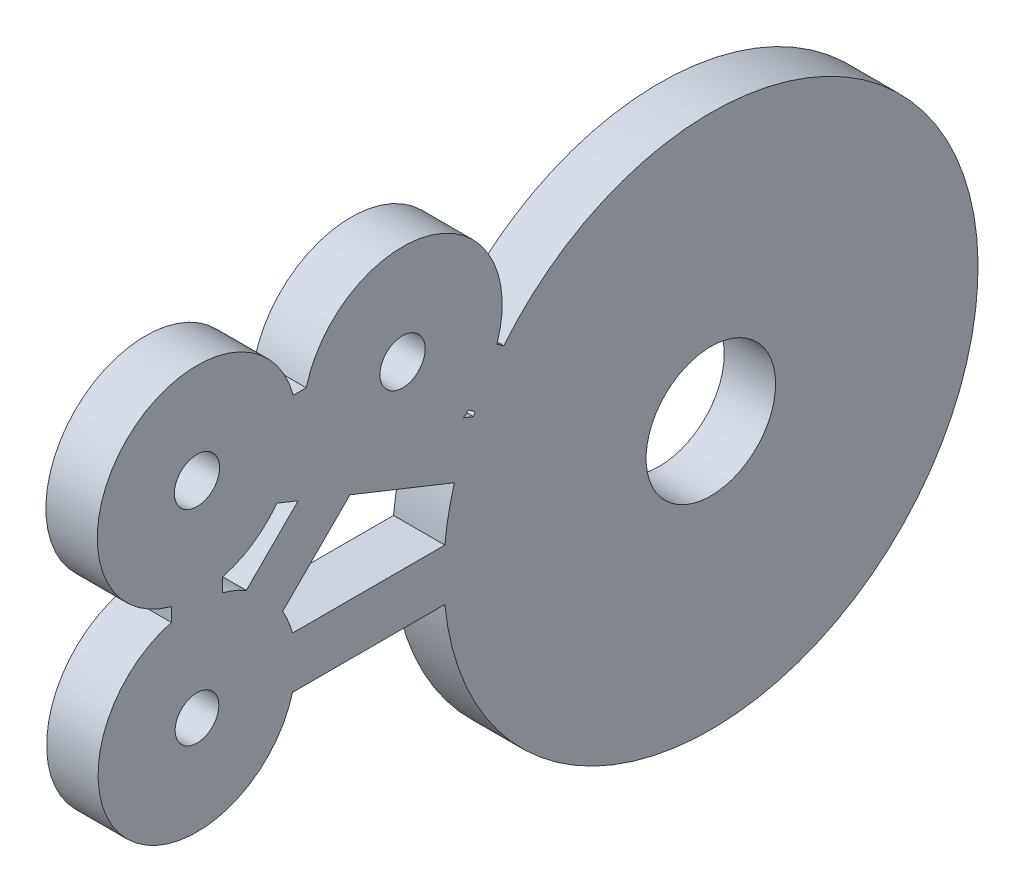
ISO-10303-21;
HEADER;
FILE_DESCRIPTION(('STEP AP214'),'2;1');
FILE_NAME('part.step','',(''),(''),'','','');
FILE_SCHEMA(('AUTOMOTIVE_DESIGN { 1 0 10303 214 1 1 1 1 }'));
ENDSEC;
DATA;
#1=APPLICATION_CONTEXT('core data for automotive mechanical design processes');
#2=APPLICATION_PROTOCOL_DEFINITION('international standard','automotive_design',2000,#1);
#3=PRODUCT_CONTEXT('',#1,'mechanical');
#4=PRODUCT('Part','Part','',(#3));
#5=PRODUCT_RELATED_PRODUCT_CATEGORY('part','',(#4));
#6=PRODUCT_DEFINITION_FORMATION('','',#4);
#7=PRODUCT_DEFINITION_CONTEXT('part definition',#1,'design');
#8=PRODUCT_DEFINITION('design','',#6,#7);
#9=PRODUCT_DEFINITION_SHAPE('','',#8);
#10=(LENGTH_UNIT() NAMED_UNIT(*) SI_UNIT(.MILLI.,.METRE.));
#11=(NAMED_UNIT(*) PLANE_ANGLE_UNIT() SI_UNIT($,.RADIAN.));
#12=(NAMED_UNIT(*) SI_UNIT($,.STERADIAN.) SOLID_ANGLE_UNIT());
#13=UNCERTAINTY_MEASURE_WITH_UNIT(LENGTH_MEASURE(1.E-05),#10,'distance_accuracy_value','');
#14=(GEOMETRIC_REPRESENTATION_CONTEXT(3) GLOBAL_UNCERTAINTY_ASSIGNED_CONTEXT((#13)) GLOBAL_UNIT_ASSIGNED_CONTEXT((#10,
#11,#12)) REPRESENTATION_CONTEXT('',''));
#15=CARTESIAN_POINT('',(0.,0.,0.));
#16=DIRECTION('',(0.,0.,1.));
#17=DIRECTION('',(1.,0.,0.));
#18=AXIS2_PLACEMENT_3D('',#15,#16,#17);
#19=CARTESIAN_POINT('',(32.6898,28.575,-32.385));
#20=DIRECTION('',(1.,0.,0.));
#21=DIRECTION('',(0.,0.,-1.));
#22=AXIS2_PLACEMENT_3D('',#19,#20,#21);
#23=CYLINDRICAL_SURFACE('',#22,4.9276);
#24=CARTESIAN_POINT('',(35.2298,28.575,-32.385));
#25=DIRECTION('',(1.,0.,0.));
#26=DIRECTION('',(0.,0.,-1.));
#27=AXIS2_PLACEMENT_3D('',#24,#25,#26);
#28=CIRCLE('',#27,4.9276);
#29=CARTESIAN_POINT('',(35.2298,26.9907051256662,-37.0509673714204));
#30=VERTEX_POINT('',#29);
#31=CARTESIAN_POINT('',(35.2298,29.845,-27.6238717975673));
#32=VERTEX_POINT('',#31);
#33=EDGE_CURVE('E317',#30,#32,#28,.T.);
#34=ORIENTED_EDGE('',*,*,#33,.F.);
#35=DIRECTION('',(1.,0.,0.));
#36=VECTOR('',#35,1.);
#37=CARTESIAN_POINT('',(32.6898,26.9907051256662,-37.0509673714204));
#38=LINE('',#37,#36);
#39=CARTESIAN_POINT('',(32.6898,26.9907051256662,-37.0509673714204));
#40=VERTEX_POINT('',#39);
#41=EDGE_CURVE('E11',#40,#30,#38,.T.);
#42=ORIENTED_EDGE('',*,*,#41,.F.);
#43=CARTESIAN_POINT('',(32.6898,28.575,-32.385));
#44=DIRECTION('',(1.,0.,0.));
#45=DIRECTION('',(0.,0.,-1.));
#46=AXIS2_PLACEMENT_3D('',#43,#44,#45);
#47=CIRCLE('',#46,4.9276);
#48=CARTESIAN_POINT('',(32.6898,29.845,-27.6238717975673));
#49=VERTEX_POINT('',#48);
#50=EDGE_CURVE('E326',#40,#49,#47,.T.);
#51=ORIENTED_EDGE('',*,*,#50,.T.);
#52=DIRECTION('',(1.,0.,0.));
#53=VECTOR('',#52,1.);
#54=CARTESIAN_POINT('',(32.6898,29.845,-27.6238717975673));
#55=LINE('',#54,#53);
#56=EDGE_CURVE('E39',#49,#32,#55,.T.);
#57=ORIENTED_EDGE('',*,*,#56,.T.);
#58=EDGE_LOOP('',(#34,#42,#51,#57));
#59=FACE_BOUND('',#58,.T.);
#60=ADVANCED_FACE('F36',(#59),#23,.T.);
#61=CARTESIAN_POINT('',(32.6898,26.7642367038293,-37.3906700041757));
#62=DIRECTION('',(0.,0.832050294337836,-0.554700196225241));
#63=DIRECTION('',(0.,0.554700196225241,0.832050294337836));
#64=AXIS2_PLACEMENT_3D('',#61,#62,#63);
#65=PLANE('',#64);
#66=DIRECTION('',(0.,0.554700196225241,0.832050294337836));
#67=VECTOR('',#66,1.);
#68=CARTESIAN_POINT('',(35.2298,26.7642367038293,-37.3906700041757));
#69=LINE('',#68,#67);
#70=CARTESIAN_POINT('',(35.2298,26.7642367038293,-37.3906700041757));
#71=VERTEX_POINT('',#70);
#72=EDGE_CURVE('E330',#71,#30,#69,.T.);
#73=ORIENTED_EDGE('',*,*,#72,.F.);
#74=DIRECTION('',(1.,0.,0.));
#75=VECTOR('',#74,1.);
#76=CARTESIAN_POINT('',(32.6898,26.7642367038293,-37.3906700041757));
#77=LINE('',#76,#75);
#78=CARTESIAN_POINT('',(32.6898,26.7642367038293,-37.3906700041757));
#79=VERTEX_POINT('',#78);
#80=EDGE_CURVE('E44',#79,#71,#77,.T.);
#81=ORIENTED_EDGE('',*,*,#80,.F.);
#82=DIRECTION('',(0.,0.554700196225241,0.832050294337836));
#83=VECTOR('',#82,1.);
#84=CARTESIAN_POINT('',(32.6898,26.7642367038293,-37.3906700041757));
#85=LINE('',#84,#83);
#86=EDGE_CURVE('E348',#79,#40,#85,.T.);
#87=ORIENTED_EDGE('',*,*,#86,.T.);
#88=ORIENTED_EDGE('',*,*,#41,.T.);
#89=EDGE_LOOP('',(#73,#81,#87,#88));
#90=FACE_BOUND('',#89,.T.);
#91=ADVANCED_FACE('F395',(#90),#65,.T.);
#92=CARTESIAN_POINT('',(32.6898,18.415,-47.625));
#93=DIRECTION('',(1.,0.,0.));
#94=DIRECTION('',(0.,0.,-1.));
#95=AXIS2_PLACEMENT_3D('',#92,#93,#94);
#96=CYLINDRICAL_SURFACE('',#95,13.208);
#97=CARTESIAN_POINT('',(35.2298,18.415,-47.625));
#98=DIRECTION('',(1.,0.,0.));
#99=DIRECTION('',(0.,0.,-1.));
#100=AXIS2_PLACEMENT_3D('',#97,#98,#99);
#101=CIRCLE('',#100,13.208);
#102=CARTESIAN_POINT('',(35.2298,17.145,-34.4781994766787));
#103=VERTEX_POINT('',#102);
#104=EDGE_CURVE('E368',#103,#71,#101,.T.);
#105=ORIENTED_EDGE('',*,*,#104,.F.);
#106=DIRECTION('',(1.,0.,0.));
#107=VECTOR('',#106,1.);
#108=CARTESIAN_POINT('',(32.6898,17.145,-34.4781994766787));
#109=LINE('',#108,#107);
#110=CARTESIAN_POINT('',(32.6898,17.145,-34.4781994766787));
#111=VERTEX_POINT('',#110);
#112=EDGE_CURVE('E374',#111,#103,#109,.T.);
#113=ORIENTED_EDGE('',*,*,#112,.F.);
#114=CARTESIAN_POINT('',(32.6898,18.415,-47.625));
#115=DIRECTION('',(1.,0.,0.));
#116=DIRECTION('',(0.,0.,-1.));
#117=AXIS2_PLACEMENT_3D('',#114,#115,#116);
#118=CIRCLE('',#117,13.208);
#119=EDGE_CURVE('E345',#111,#79,#118,.T.);
#120=ORIENTED_EDGE('',*,*,#119,.T.);
#121=ORIENTED_EDGE('',*,*,#80,.T.);
#122=EDGE_LOOP('',(#105,#113,#120,#121));
#123=FACE_BOUND('',#122,.T.);
#124=ADVANCED_FACE('F415',(#123),#96,.T.);
#125=CARTESIAN_POINT('',(32.6898,17.145,-26.9466851070354));
#126=DIRECTION('',(0.,-1.,0.));
#127=DIRECTION('',(0.,0.,-1.));
#128=AXIS2_PLACEMENT_3D('',#125,#126,#127);
#129=PLANE('',#128);
#130=DIRECTION('',(0.,0.,-1.));
#131=VECTOR('',#130,1.);
#132=CARTESIAN_POINT('',(35.2298,17.145,-26.9466851070354));
#133=LINE('',#132,#131);
#134=CARTESIAN_POINT('',(35.2298,17.145,-26.9466851070354));
#135=VERTEX_POINT('',#134);
#136=EDGE_CURVE('E365',#135,#103,#133,.T.);
#137=ORIENTED_EDGE('',*,*,#136,.F.);
#138=DIRECTION('',(1.,0.,0.));
#139=VECTOR('',#138,1.);
#140=CARTESIAN_POINT('',(32.6898,17.145,-26.9466851070354));
#141=LINE('',#140,#139);
#142=CARTESIAN_POINT('',(32.6898,17.145,-26.9466851070354));
#143=VERTEX_POINT('',#142);
#144=EDGE_CURVE('E376',#143,#135,#141,.T.);
#145=ORIENTED_EDGE('',*,*,#144,.F.);
#146=DIRECTION('',(0.,0.,-1.));
#147=VECTOR('',#146,1.);
#148=CARTESIAN_POINT('',(32.6898,17.145,-26.9466851070354));
#149=LINE('',#148,#147);
#150=EDGE_CURVE('E342',#143,#111,#149,.T.);
#151=ORIENTED_EDGE('',*,*,#150,.T.);
#152=ORIENTED_EDGE('',*,*,#112,.T.);
#153=EDGE_LOOP('',(#137,#145,#151,#152));
#154=FACE_BOUND('',#153,.T.);
#155=ADVANCED_FACE('F413',(#154),#129,.T.);
#156=CARTESIAN_POINT('',(32.6898,18.415,-22.225));
#157=DIRECTION('',(1.,0.,0.));
#158=DIRECTION('',(0.,0.,-1.));
#159=AXIS2_PLACEMENT_3D('',#156,#157,#158);
#160=CYLINDRICAL_SURFACE('',#159,4.8895);
#161=CARTESIAN_POINT('',(35.2298,18.415,-22.225));
#162=DIRECTION('',(1.,0.,0.));
#163=DIRECTION('',(0.,0.,-1.));
#164=AXIS2_PLACEMENT_3D('',#161,#162,#163);
#165=CIRCLE('',#164,4.8895);
#166=CARTESIAN_POINT('',(35.2298,23.1366851070354,-20.955));
#167=VERTEX_POINT('',#166);
#168=EDGE_CURVE('E362',#167,#135,#165,.T.);
#169=ORIENTED_EDGE('',*,*,#168,.F.);
#170=DIRECTION('',(1.,0.,0.));
#171=VECTOR('',#170,1.);
#172=CARTESIAN_POINT('',(32.6898,23.1366851070354,-20.955));
#173=LINE('',#172,#171);
#174=CARTESIAN_POINT('',(32.6898,23.1366851070354,-20.955));
#175=VERTEX_POINT('',#174);
#176=EDGE_CURVE('E378',#175,#167,#173,.T.);
#177=ORIENTED_EDGE('',*,*,#176,.F.);
#178=CARTESIAN_POINT('',(32.6898,18.415,-22.225));
#179=DIRECTION('',(1.,0.,0.));
#180=DIRECTION('',(0.,0.,-1.));
#181=AXIS2_PLACEMENT_3D('',#178,#179,#180);
#182=CIRCLE('',#181,4.8895);
#183=EDGE_CURVE('E339',#175,#143,#182,.T.);
#184=ORIENTED_EDGE('',*,*,#183,.T.);
#185=ORIENTED_EDGE('',*,*,#144,.T.);
#186=EDGE_LOOP('',(#169,#177,#184,#185));
#187=FACE_BOUND('',#186,.T.);
#188=ADVANCED_FACE('F409',(#187),#160,.T.);
#189=CARTESIAN_POINT('',(32.6898,23.8138717975673,-20.955));
#190=DIRECTION('',(0.,0.,1.));
#191=DIRECTION('',(0.,-1.,0.));
#192=AXIS2_PLACEMENT_3D('',#189,#190,#191);
#193=PLANE('',#192);
#194=DIRECTION('',(0.,-1.,0.));
#195=VECTOR('',#194,1.);
#196=CARTESIAN_POINT('',(35.2298,23.8138717975673,-20.955));
#197=LINE('',#196,#195);
#198=CARTESIAN_POINT('',(35.2298,23.8138717975673,-20.955));
#199=VERTEX_POINT('',#198);
#200=EDGE_CURVE('E359',#199,#167,#197,.T.);
#201=ORIENTED_EDGE('',*,*,#200,.F.);
#202=DIRECTION('',(1.,0.,0.));
#203=VECTOR('',#202,1.);
#204=CARTESIAN_POINT('',(32.6898,23.8138717975673,-20.955));
#205=LINE('',#204,#203);
#206=CARTESIAN_POINT('',(32.6898,23.8138717975673,-20.955));
#207=VERTEX_POINT('',#206);
#208=EDGE_CURVE('E380',#207,#199,#205,.T.);
#209=ORIENTED_EDGE('',*,*,#208,.F.);
#210=DIRECTION('',(0.,-1.,0.));
#211=VECTOR('',#210,1.);
#212=CARTESIAN_POINT('',(32.6898,23.8138717975673,-20.955));
#213=LINE('',#212,#211);
#214=EDGE_CURVE('E336',#207,#175,#213,.T.);
#215=ORIENTED_EDGE('',*,*,#214,.T.);
#216=ORIENTED_EDGE('',*,*,#176,.T.);
#217=EDGE_LOOP('',(#201,#209,#215,#216));
#218=FACE_BOUND('',#217,.T.);
#219=ADVANCED_FACE('F407',(#218),#193,.T.);
#220=CARTESIAN_POINT('',(32.6898,28.575,-22.225));
#221=DIRECTION('',(1.,0.,0.));
#222=DIRECTION('',(0.,0.,-1.));
#223=AXIS2_PLACEMENT_3D('',#220,#221,#222);
#224=CYLINDRICAL_SURFACE('',#223,4.9276);
#225=CARTESIAN_POINT('',(35.2298,28.575,-22.225));
#226=DIRECTION('',(1.,0.,0.));
#227=DIRECTION('',(0.,0.,-1.));
#228=AXIS2_PLACEMENT_3D('',#225,#226,#227);
#229=CIRCLE('',#228,4.9276);
#230=CARTESIAN_POINT('',(35.2298,29.845,-26.9861282024327));
#231=VERTEX_POINT('',#230);
#232=EDGE_CURVE('E356',#231,#199,#229,.T.);
#233=ORIENTED_EDGE('',*,*,#232,.F.);
#234=DIRECTION('',(1.,0.,0.));
#235=VECTOR('',#234,1.);
#236=CARTESIAN_POINT('',(32.6898,29.845,-26.9861282024327));
#237=LINE('',#236,#235);
#238=CARTESIAN_POINT('',(32.6898,29.845,-26.9861282024327));
#239=VERTEX_POINT('',#238);
#240=EDGE_CURVE('E381',#239,#231,#237,.T.);
#241=ORIENTED_EDGE('',*,*,#240,.F.);
#242=CARTESIAN_POINT('',(32.6898,28.575,-22.225));
#243=DIRECTION('',(1.,0.,0.));
#244=DIRECTION('',(0.,0.,-1.));
#245=AXIS2_PLACEMENT_3D('',#242,#243,#244);
#246=CIRCLE('',#245,4.9276);
#247=EDGE_CURVE('E333',#239,#207,#246,.T.);
#248=ORIENTED_EDGE('',*,*,#247,.T.);
#249=ORIENTED_EDGE('',*,*,#208,.T.);
#250=EDGE_LOOP('',(#233,#241,#248,#249));
#251=FACE_BOUND('',#250,.T.);
#252=ADVANCED_FACE('F403',(#251),#224,.T.);
#253=CARTESIAN_POINT('',(32.6898,29.845,-27.6238717975673));
#254=DIRECTION('',(0.,1.,0.));
#255=DIRECTION('',(0.,0.,1.));
#256=AXIS2_PLACEMENT_3D('',#253,#254,#255);
#257=PLANE('',#256);
#258=DIRECTION('',(0.,0.,1.));
#259=VECTOR('',#258,1.);
#260=CARTESIAN_POINT('',(35.2298,29.845,-27.6238717975673));
#261=LINE('',#260,#259);
#262=EDGE_CURVE('E353',#32,#231,#261,.T.);
#263=ORIENTED_EDGE('',*,*,#262,.F.);
#264=ORIENTED_EDGE('',*,*,#56,.F.);
#265=DIRECTION('',(0.,0.,1.));
#266=VECTOR('',#265,1.);
#267=CARTESIAN_POINT('',(32.6898,29.845,-27.6238717975673));
#268=LINE('',#267,#266);
#269=EDGE_CURVE('E329',#49,#239,#268,.T.);
#270=ORIENTED_EDGE('',*,*,#269,.T.);
#271=ORIENTED_EDGE('',*,*,#240,.T.);
#272=EDGE_LOOP('',(#263,#264,#270,#271));
#273=FACE_BOUND('',#272,.T.);
#274=ADVANCED_FACE('F389',(#273),#257,.T.);
#275=CARTESIAN_POINT('',(32.6898,28.575,-32.385));
#276=DIRECTION('',(1.,0.,0.));
#277=DIRECTION('',(0.,0.,-1.));
#278=AXIS2_PLACEMENT_3D('',#275,#276,#277);
#279=PLANE('',#278);
#280=DIRECTION('',(0.,-1.,0.));
#281=VECTOR('',#280,1.);
#282=CARTESIAN_POINT('',(32.6898,23.1366851070354,-23.495));
#283=LINE('',#282,#281);
#284=CARTESIAN_POINT('',(32.6898,23.8138717975673,-23.495));
#285=VERTEX_POINT('',#284);
#286=CARTESIAN_POINT('',(32.6898,23.1366851070354,-23.495));
#287=VERTEX_POINT('',#286);
#288=EDGE_CURVE('E193',#285,#287,#283,.T.);
#289=ORIENTED_EDGE('',*,*,#288,.T.);
#290=CARTESIAN_POINT('',(32.6898,18.415,-22.225));
#291=DIRECTION('',(-1.,0.,0.));
#292=DIRECTION('',(0.,0.,-1.));
#293=AXIS2_PLACEMENT_3D('',#290,#291,#292);
#294=CIRCLE('',#293,4.8895);
#295=CARTESIAN_POINT('',(32.6898,22.6517611699192,-24.6657099457054));
#296=VERTEX_POINT('',#295);
#297=EDGE_CURVE('E187',#287,#296,#294,.T.);
#298=ORIENTED_EDGE('',*,*,#297,.T.);
#299=DIRECTION('',(0.,0.707106781186547,-0.707106781186547));
#300=VECTOR('',#299,1.);
#301=CARTESIAN_POINT('',(32.6898,22.6517611699192,-24.6657099457054));
#302=LINE('',#301,#300);
#303=CARTESIAN_POINT('',(32.6898,25.2082775919095,-27.2222263676957));
#304=VERTEX_POINT('',#303);
#305=EDGE_CURVE('E196',#296,#304,#302,.T.);
#306=ORIENTED_EDGE('',*,*,#305,.T.);
#307=DIRECTION('',(0.,0.371390676354106,0.928476690885258));
#308=VECTOR('',#307,1.);
#309=CARTESIAN_POINT('',(32.6898,25.6275959792656,-26.1739303993055));
#310=LINE('',#309,#308);
#311=CARTESIAN_POINT('',(32.6898,25.6275959792656,-26.1739303993055));
#312=VERTEX_POINT('',#311);
#313=EDGE_CURVE('E52',#304,#312,#310,.T.);
#314=ORIENTED_EDGE('',*,*,#313,.T.);
#315=CARTESIAN_POINT('',(32.6898,28.575,-22.225));
#316=DIRECTION('',(-1.,0.,0.));
#317=DIRECTION('',(0.,0.,-1.));
#318=AXIS2_PLACEMENT_3D('',#315,#316,#317);
#319=CIRCLE('',#318,4.9276);
#320=EDGE_CURVE('E211',#312,#285,#319,.T.);
#321=ORIENTED_EDGE('',*,*,#320,.T.);
#322=EDGE_LOOP('',(#289,#298,#306,#314,#321));
#323=FACE_BOUND('',#322,.T.);
#324=CARTESIAN_POINT('',(32.6898,18.415,-47.625));
#325=DIRECTION('',(1.,0.,0.));
#326=DIRECTION('',(0.,0.,-1.));
#327=AXIS2_PLACEMENT_3D('',#324,#325,#326);
#328=CIRCLE('',#327,3.2004);
#329=CARTESIAN_POINT('',(32.6898,18.415,-50.8254));
#330=VERTEX_POINT('',#329);
#331=EDGE_CURVE('E230',#330,#330,#328,.T.);
#332=ORIENTED_EDGE('',*,*,#331,.T.);
#333=EDGE_LOOP('',(#332));
#334=FACE_BOUND('',#333,.T.);
#335=DIRECTION('',(0.,-0.371390676354097,-0.928476690885262));
#336=VECTOR('',#335,1.);
#337=CARTESIAN_POINT('',(32.6898,24.6744017182742,-35.3960753568448));
#338=LINE('',#337,#336);
#339=CARTESIAN_POINT('',(32.6898,24.6744017182742,-35.3960753568448));
#340=VERTEX_POINT('',#339);
#341=CARTESIAN_POINT('',(32.6898,24.476764535673,-35.8901683133478));
#342=VERTEX_POINT('',#341);
#343=EDGE_CURVE('E246',#340,#342,#338,.T.);
#344=ORIENTED_EDGE('',*,*,#343,.T.);
#345=CARTESIAN_POINT('',(32.6898,18.415,-47.625));
#346=DIRECTION('',(-1.,0.,0.));
#347=DIRECTION('',(0.,0.,-1.));
#348=AXIS2_PLACEMENT_3D('',#345,#346,#347);
#349=CIRCLE('',#348,13.208);
#350=CARTESIAN_POINT('',(32.6898,24.6508289562112,-35.9817315057636));
#351=VERTEX_POINT('',#350);
#352=EDGE_CURVE('E236',#342,#351,#349,.T.);
#353=ORIENTED_EDGE('',*,*,#352,.T.);
#354=DIRECTION('',(0.,0.554700196225229,0.832050294337844));
#355=VECTOR('',#354,1.);
#356=CARTESIAN_POINT('',(32.6898,24.877297378048,-35.6420288730083));
#357=LINE('',#356,#355);
#358=CARTESIAN_POINT('',(32.6898,24.877297378048,-35.6420288730083));
#359=VERTEX_POINT('',#358);
#360=EDGE_CURVE('E239',#351,#359,#357,.T.);
#361=ORIENTED_EDGE('',*,*,#360,.T.);
#362=CARTESIAN_POINT('',(32.6898,28.575,-32.385));
#363=DIRECTION('',(-1.,0.,0.));
#364=DIRECTION('',(0.,0.,-1.));
#365=AXIS2_PLACEMENT_3D('',#362,#363,#364);
#366=CIRCLE('',#365,4.9276);
#367=EDGE_CURVE('E243',#359,#340,#366,.T.);
#368=ORIENTED_EDGE('',*,*,#367,.T.);
#369=EDGE_LOOP('',(#344,#353,#361,#368));
#370=FACE_BOUND('',#369,.T.);
#371=CARTESIAN_POINT('',(32.6898,28.575,-32.385));
#372=DIRECTION('',(1.,0.,0.));
#373=DIRECTION('',(0.,0.,-1.));
#374=AXIS2_PLACEMENT_3D('',#371,#372,#373);
#375=CIRCLE('',#374,1.11759999999999);
#376=CARTESIAN_POINT('',(32.6898,28.575,-33.5026));
#377=VERTEX_POINT('',#376);
#378=EDGE_CURVE('E268',#377,#377,#375,.T.);
#379=ORIENTED_EDGE('',*,*,#378,.T.);
#380=EDGE_LOOP('',(#379));
#381=FACE_BOUND('',#380,.T.);
#382=CARTESIAN_POINT('',(32.6898,28.575,-22.225));
#383=DIRECTION('',(1.,0.,0.));
#384=DIRECTION('',(0.,0.,-1.));
#385=AXIS2_PLACEMENT_3D('',#382,#383,#384);
#386=CIRCLE('',#385,1.1176);
#387=CARTESIAN_POINT('',(32.6898,28.575,-23.3426));
#388=VERTEX_POINT('',#387);
#389=EDGE_CURVE('E274',#388,#388,#386,.T.);
#390=ORIENTED_EDGE('',*,*,#389,.T.);
#391=EDGE_LOOP('',(#390));
#392=FACE_BOUND('',#391,.T.);
#393=CARTESIAN_POINT('',(32.6898,18.415,-22.225));
#394=DIRECTION('',(1.,0.,0.));
#395=DIRECTION('',(0.,0.,-1.));
#396=AXIS2_PLACEMENT_3D('',#393,#394,#395);
#397=CIRCLE('',#396,1.0795);
#398=CARTESIAN_POINT('',(32.6898,18.415,-23.3045));
#399=VERTEX_POINT('',#398);
#400=EDGE_CURVE('E280',#399,#399,#397,.T.);
#401=ORIENTED_EDGE('',*,*,#400,.T.);
#402=EDGE_LOOP('',(#401));
#403=FACE_BOUND('',#402,.T.);
#404=DIRECTION('',(0.,0.371390676354104,0.928476690885259));
#405=VECTOR('',#404,1.);
#406=CARTESIAN_POINT('',(32.6898,24.1819626066445,-29.7880138308583));
#407=LINE('',#406,#405);
#408=CARTESIAN_POINT('',(32.6898,22.1184337408245,-34.9468359954084));
#409=VERTEX_POINT('',#408);
#410=CARTESIAN_POINT('',(32.6898,24.1819626066445,-29.7880138308583));
#411=VERTEX_POINT('',#410);
#412=EDGE_CURVE('E299',#409,#411,#407,.T.);
#413=ORIENTED_EDGE('',*,*,#412,.T.);
#414=DIRECTION('',(0.,-0.707106781186547,0.707106781186548));
#415=VECTOR('',#414,1.);
#416=CARTESIAN_POINT('',(32.6898,20.8557099457054,-26.4617611699192));
#417=LINE('',#416,#415);
#418=CARTESIAN_POINT('',(32.6898,20.8557099457054,-26.4617611699192));
#419=VERTEX_POINT('',#418);
#420=EDGE_CURVE('E286',#411,#419,#417,.T.);
#421=ORIENTED_EDGE('',*,*,#420,.T.);
#422=CARTESIAN_POINT('',(32.6898,18.415,-22.225));
#423=DIRECTION('',(-1.,0.,0.));
#424=DIRECTION('',(0.,0.,-1.));
#425=AXIS2_PLACEMENT_3D('',#422,#423,#424);
#426=CIRCLE('',#425,4.8895);
#427=CARTESIAN_POINT('',(32.6898,19.685,-26.9466851070354));
#428=VERTEX_POINT('',#427);
#429=EDGE_CURVE('E289',#419,#428,#426,.T.);
#430=ORIENTED_EDGE('',*,*,#429,.T.);
#431=DIRECTION('',(0.,0.,-1.));
#432=VECTOR('',#431,1.);
#433=CARTESIAN_POINT('',(32.6898,19.685,-34.4781994766787));
#434=LINE('',#433,#432);
#435=CARTESIAN_POINT('',(32.6898,19.685,-34.4781994766787));
#436=VERTEX_POINT('',#435);
#437=EDGE_CURVE('E293',#428,#436,#434,.T.);
#438=ORIENTED_EDGE('',*,*,#437,.T.);
#439=CARTESIAN_POINT('',(32.6898,18.415,-47.625));
#440=DIRECTION('',(-1.,0.,0.));
#441=DIRECTION('',(0.,0.,-1.));
#442=AXIS2_PLACEMENT_3D('',#439,#440,#441);
#443=CIRCLE('',#442,13.208);
#444=EDGE_CURVE('E296',#436,#409,#443,.T.);
#445=ORIENTED_EDGE('',*,*,#444,.T.);
#446=EDGE_LOOP('',(#413,#421,#430,#438,#445));
#447=FACE_BOUND('',#446,.T.);
#448=ORIENTED_EDGE('',*,*,#50,.F.);
#449=ORIENTED_EDGE('',*,*,#86,.F.);
#450=ORIENTED_EDGE('',*,*,#119,.F.);
#451=ORIENTED_EDGE('',*,*,#150,.F.);
#452=ORIENTED_EDGE('',*,*,#183,.F.);
#453=ORIENTED_EDGE('',*,*,#214,.F.);
#454=ORIENTED_EDGE('',*,*,#247,.F.);
#455=ORIENTED_EDGE('',*,*,#269,.F.);
#456=EDGE_LOOP('',(#448,#449,#450,#451,#452,#453,#454,#455));
#457=FACE_BOUND('',#456,.T.);
#458=ADVANCED_FACE('F200',(#323,#334,#370,#381,#392,#403,#447,#457),#279,.F.);
#459=CARTESIAN_POINT('',(35.2298,28.575,-32.385));
#460=DIRECTION('',(1.,0.,0.));
#461=DIRECTION('',(0.,0.,-1.));
#462=AXIS2_PLACEMENT_3D('',#459,#460,#461);
#463=PLANE('',#462);
#464=CARTESIAN_POINT('',(35.2298,18.415,-22.225));
#465=DIRECTION('',(-1.,0.,0.));
#466=DIRECTION('',(0.,0.,-1.));
#467=AXIS2_PLACEMENT_3D('',#464,#465,#466);
#468=CIRCLE('',#467,4.8895);
#469=CARTESIAN_POINT('',(35.2298,23.1366851070354,-23.495));
#470=VERTEX_POINT('',#469);
#471=CARTESIAN_POINT('',(35.2298,22.6517611699192,-24.6657099457054));
#472=VERTEX_POINT('',#471);
#473=EDGE_CURVE('E60',#470,#472,#468,.T.);
#474=ORIENTED_EDGE('',*,*,#473,.F.);
#475=DIRECTION('',(0.,-1.,0.));
#476=VECTOR('',#475,1.);
#477=CARTESIAN_POINT('',(35.2298,23.1366851070354,-23.495));
#478=LINE('',#477,#476);
#479=CARTESIAN_POINT('',(35.2298,23.8138717975673,-23.495));
#480=VERTEX_POINT('',#479);
#481=EDGE_CURVE('E204',#480,#470,#478,.T.);
#482=ORIENTED_EDGE('',*,*,#481,.F.);
#483=CARTESIAN_POINT('',(35.2298,28.575,-22.225));
#484=DIRECTION('',(-1.,0.,0.));
#485=DIRECTION('',(0.,0.,-1.));
#486=AXIS2_PLACEMENT_3D('',#483,#484,#485);
#487=CIRCLE('',#486,4.9276);
#488=CARTESIAN_POINT('',(35.2298,25.6275959792656,-26.1739303993055));
#489=VERTEX_POINT('',#488);
#490=EDGE_CURVE('E207',#489,#480,#487,.T.);
#491=ORIENTED_EDGE('',*,*,#490,.F.);
#492=DIRECTION('',(0.,0.371390676354106,0.928476690885258));
#493=VECTOR('',#492,1.);
#494=CARTESIAN_POINT('',(35.2298,25.6275959792656,-26.1739303993055));
#495=LINE('',#494,#493);
#496=CARTESIAN_POINT('',(35.2298,25.2082775919095,-27.2222263676957));
#497=VERTEX_POINT('',#496);
#498=EDGE_CURVE('E217',#497,#489,#495,.T.);
#499=ORIENTED_EDGE('',*,*,#498,.F.);
#500=DIRECTION('',(0.,0.707106781186547,-0.707106781186547));
#501=VECTOR('',#500,1.);
#502=CARTESIAN_POINT('',(35.2298,22.6517611699192,-24.6657099457054));
#503=LINE('',#502,#501);
#504=EDGE_CURVE('E215',#472,#497,#503,.T.);
#505=ORIENTED_EDGE('',*,*,#504,.F.);
#506=EDGE_LOOP('',(#474,#482,#491,#499,#505));
#507=FACE_BOUND('',#506,.T.);
#508=CARTESIAN_POINT('',(35.2298,18.415,-47.625));
#509=DIRECTION('',(1.,0.,0.));
#510=DIRECTION('',(0.,0.,-1.));
#511=AXIS2_PLACEMENT_3D('',#508,#509,#510);
#512=CIRCLE('',#511,3.2004);
#513=CARTESIAN_POINT('',(35.2298,18.415,-50.8254));
#514=VERTEX_POINT('',#513);
#515=EDGE_CURVE('E224',#514,#514,#512,.T.);
#516=ORIENTED_EDGE('',*,*,#515,.F.);
#517=EDGE_LOOP('',(#516));
#518=FACE_BOUND('',#517,.T.);
#519=CARTESIAN_POINT('',(35.2298,18.415,-47.625));
#520=DIRECTION('',(-1.,0.,0.));
#521=DIRECTION('',(0.,0.,-1.));
#522=AXIS2_PLACEMENT_3D('',#519,#520,#521);
#523=CIRCLE('',#522,13.208);
#524=CARTESIAN_POINT('',(35.2298,24.476764535673,-35.8901683133478));
#525=VERTEX_POINT('',#524);
#526=CARTESIAN_POINT('',(35.2298,24.6508289562112,-35.9817315057636));
#527=VERTEX_POINT('',#526);
#528=EDGE_CURVE('E233',#525,#527,#523,.T.);
#529=ORIENTED_EDGE('',*,*,#528,.F.);
#530=DIRECTION('',(0.,-0.371390676354097,-0.928476690885262));
#531=VECTOR('',#530,1.);
#532=CARTESIAN_POINT('',(35.2298,24.6744017182742,-35.3960753568448));
#533=LINE('',#532,#531);
#534=CARTESIAN_POINT('',(35.2298,24.6744017182742,-35.3960753568448));
#535=VERTEX_POINT('',#534);
#536=EDGE_CURVE('E240',#535,#525,#533,.T.);
#537=ORIENTED_EDGE('',*,*,#536,.F.);
#538=CARTESIAN_POINT('',(35.2298,28.575,-32.385));
#539=DIRECTION('',(-1.,0.,0.));
#540=DIRECTION('',(0.,0.,-1.));
#541=AXIS2_PLACEMENT_3D('',#538,#539,#540);
#542=CIRCLE('',#541,4.9276);
#543=CARTESIAN_POINT('',(35.2298,24.877297378048,-35.6420288730083));
#544=VERTEX_POINT('',#543);
#545=EDGE_CURVE('E254',#544,#535,#542,.T.);
#546=ORIENTED_EDGE('',*,*,#545,.F.);
#547=DIRECTION('',(0.,0.554700196225229,0.832050294337844));
#548=VECTOR('',#547,1.);
#549=CARTESIAN_POINT('',(35.2298,24.877297378048,-35.6420288730083));
#550=LINE('',#549,#548);
#551=EDGE_CURVE('E251',#527,#544,#550,.T.);
#552=ORIENTED_EDGE('',*,*,#551,.F.);
#553=EDGE_LOOP('',(#529,#537,#546,#552));
#554=FACE_BOUND('',#553,.T.);
#555=CARTESIAN_POINT('',(35.2298,28.575,-32.385));
#556=DIRECTION('',(1.,0.,0.));
#557=DIRECTION('',(0.,0.,-1.));
#558=AXIS2_PLACEMENT_3D('',#555,#556,#557);
#559=CIRCLE('',#558,1.11759999999999);
#560=CARTESIAN_POINT('',(35.2298,28.575,-33.5026));
#561=VERTEX_POINT('',#560);
#562=EDGE_CURVE('E261',#561,#561,#559,.T.);
#563=ORIENTED_EDGE('',*,*,#562,.F.);
#564=EDGE_LOOP('',(#563));
#565=FACE_BOUND('',#564,.T.);
#566=CARTESIAN_POINT('',(35.2298,28.575,-22.225));
#567=DIRECTION('',(1.,0.,0.));
#568=DIRECTION('',(0.,0.,-1.));
#569=AXIS2_PLACEMENT_3D('',#566,#567,#568);
#570=CIRCLE('',#569,1.1176);
#571=CARTESIAN_POINT('',(35.2298,28.575,-23.3426));
#572=VERTEX_POINT('',#571);
#573=EDGE_CURVE('E271',#572,#572,#570,.T.);
#574=ORIENTED_EDGE('',*,*,#573,.F.);
#575=EDGE_LOOP('',(#574));
#576=FACE_BOUND('',#575,.T.);
#577=CARTESIAN_POINT('',(35.2298,18.415,-22.225));
#578=DIRECTION('',(1.,0.,0.));
#579=DIRECTION('',(0.,0.,-1.));
#580=AXIS2_PLACEMENT_3D('',#577,#578,#579);
#581=CIRCLE('',#580,1.0795);
#582=CARTESIAN_POINT('',(35.2298,18.415,-23.3045));
#583=VERTEX_POINT('',#582);
#584=EDGE_CURVE('E277',#583,#583,#581,.T.);
#585=ORIENTED_EDGE('',*,*,#584,.F.);
#586=EDGE_LOOP('',(#585));
#587=FACE_BOUND('',#586,.T.);
#588=DIRECTION('',(0.,-0.707106781186547,0.707106781186548));
#589=VECTOR('',#588,1.);
#590=CARTESIAN_POINT('',(35.2298,20.8557099457054,-26.4617611699192));
#591=LINE('',#590,#589);
#592=CARTESIAN_POINT('',(35.2298,24.1819626066445,-29.7880138308583));
#593=VERTEX_POINT('',#592);
#594=CARTESIAN_POINT('',(35.2298,20.8557099457054,-26.4617611699192));
#595=VERTEX_POINT('',#594);
#596=EDGE_CURVE('E283',#593,#595,#591,.T.);
#597=ORIENTED_EDGE('',*,*,#596,.F.);
#598=DIRECTION('',(0.,0.371390676354104,0.928476690885259));
#599=VECTOR('',#598,1.);
#600=CARTESIAN_POINT('',(35.2298,24.1819626066445,-29.7880138308583));
#601=LINE('',#600,#599);
#602=CARTESIAN_POINT('',(35.2298,22.1184337408245,-34.9468359954084));
#603=VERTEX_POINT('',#602);
#604=EDGE_CURVE('E290',#603,#593,#601,.T.);
#605=ORIENTED_EDGE('',*,*,#604,.F.);
#606=CARTESIAN_POINT('',(35.2298,18.415,-47.625));
#607=DIRECTION('',(-1.,0.,0.));
#608=DIRECTION('',(0.,0.,-1.));
#609=AXIS2_PLACEMENT_3D('',#606,#607,#608);
#610=CIRCLE('',#609,13.208);
#611=CARTESIAN_POINT('',(35.2298,19.685,-34.4781994766787));
#612=VERTEX_POINT('',#611);
#613=EDGE_CURVE('E310',#612,#603,#610,.T.);
#614=ORIENTED_EDGE('',*,*,#613,.F.);
#615=DIRECTION('',(0.,0.,-1.));
#616=VECTOR('',#615,1.);
#617=CARTESIAN_POINT('',(35.2298,19.685,-34.4781994766787));
#618=LINE('',#617,#616);
#619=CARTESIAN_POINT('',(35.2298,19.685,-26.9466851070354));
#620=VERTEX_POINT('',#619);
#621=EDGE_CURVE('E307',#620,#612,#618,.T.);
#622=ORIENTED_EDGE('',*,*,#621,.F.);
#623=CARTESIAN_POINT('',(35.2298,18.415,-22.225));
#624=DIRECTION('',(-1.,0.,0.));
#625=DIRECTION('',(0.,0.,-1.));
#626=AXIS2_PLACEMENT_3D('',#623,#624,#625);
#627=CIRCLE('',#626,4.8895);
#628=EDGE_CURVE('E304',#595,#620,#627,.T.);
#629=ORIENTED_EDGE('',*,*,#628,.F.);
#630=EDGE_LOOP('',(#597,#605,#614,#622,#629));
#631=FACE_BOUND('',#630,.T.);
#632=ORIENTED_EDGE('',*,*,#33,.T.);
#633=ORIENTED_EDGE('',*,*,#262,.T.);
#634=ORIENTED_EDGE('',*,*,#232,.T.);
#635=ORIENTED_EDGE('',*,*,#200,.T.);
#636=ORIENTED_EDGE('',*,*,#168,.T.);
#637=ORIENTED_EDGE('',*,*,#136,.T.);
#638=ORIENTED_EDGE('',*,*,#104,.T.);
#639=ORIENTED_EDGE('',*,*,#72,.T.);
#640=EDGE_LOOP('',(#632,#633,#634,#635,#636,#637,#638,#639));
#641=FACE_BOUND('',#640,.T.);
#642=ADVANCED_FACE('F391',(#507,#518,#554,#565,#576,#587,#631,#641),#463,.T.);
#643=CARTESIAN_POINT('',(32.6898,20.8557099457054,-26.4617611699192));
#644=DIRECTION('',(0.,0.707106781186548,0.707106781186547));
#645=DIRECTION('',(0.,-0.707106781186547,0.707106781186548));
#646=AXIS2_PLACEMENT_3D('',#643,#644,#645);
#647=PLANE('',#646);
#648=ORIENTED_EDGE('',*,*,#596,.T.);
#649=DIRECTION('',(1.,0.,0.));
#650=VECTOR('',#649,1.);
#651=CARTESIAN_POINT('',(32.6898,20.8557099457054,-26.4617611699192));
#652=LINE('',#651,#650);
#653=EDGE_CURVE('E302',#419,#595,#652,.T.);
#654=ORIENTED_EDGE('',*,*,#653,.F.);
#655=ORIENTED_EDGE('',*,*,#420,.F.);
#656=DIRECTION('',(1.,0.,0.));
#657=VECTOR('',#656,1.);
#658=CARTESIAN_POINT('',(32.6898,24.1819626066445,-29.7880138308583));
#659=LINE('',#658,#657);
#660=EDGE_CURVE('E315',#411,#593,#659,.T.);
#661=ORIENTED_EDGE('',*,*,#660,.T.);
#662=EDGE_LOOP('',(#648,#654,#655,#661));
#663=FACE_BOUND('',#662,.T.);
#664=ADVANCED_FACE('F491',(#663),#647,.F.);
#665=CARTESIAN_POINT('',(32.6898,24.1819626066445,-29.7880138308583));
#666=DIRECTION('',(0.,0.928476690885259,-0.371390676354104));
#667=DIRECTION('',(0.,0.371390676354104,0.928476690885259));
#668=AXIS2_PLACEMENT_3D('',#665,#666,#667);
#669=PLANE('',#668);
#670=ORIENTED_EDGE('',*,*,#604,.T.);
#671=ORIENTED_EDGE('',*,*,#660,.F.);
#672=ORIENTED_EDGE('',*,*,#412,.F.);
#673=DIRECTION('',(1.,0.,0.));
#674=VECTOR('',#673,1.);
#675=CARTESIAN_POINT('',(32.6898,22.1184337408245,-34.9468359954084));
#676=LINE('',#675,#674);
#677=EDGE_CURVE('E318',#409,#603,#676,.T.);
#678=ORIENTED_EDGE('',*,*,#677,.T.);
#679=EDGE_LOOP('',(#670,#671,#672,#678));
#680=FACE_BOUND('',#679,.T.);
#681=ADVANCED_FACE('F501',(#680),#669,.F.);
#682=CARTESIAN_POINT('',(32.6898,18.415,-47.625));
#683=DIRECTION('',(1.,0.,0.));
#684=DIRECTION('',(0.,0.,-1.));
#685=AXIS2_PLACEMENT_3D('',#682,#683,#684);
#686=CYLINDRICAL_SURFACE('',#685,13.208);
#687=ORIENTED_EDGE('',*,*,#613,.T.);
#688=ORIENTED_EDGE('',*,*,#677,.F.);
#689=ORIENTED_EDGE('',*,*,#444,.F.);
#690=DIRECTION('',(1.,0.,0.));
#691=VECTOR('',#690,1.);
#692=CARTESIAN_POINT('',(32.6898,19.685,-34.4781994766787));
#693=LINE('',#692,#691);
#694=EDGE_CURVE('E320',#436,#612,#693,.T.);
#695=ORIENTED_EDGE('',*,*,#694,.T.);
#696=EDGE_LOOP('',(#687,#688,#689,#695));
#697=FACE_BOUND('',#696,.T.);
#698=ADVANCED_FACE('F511',(#697),#686,.T.);
#699=CARTESIAN_POINT('',(32.6898,19.685,-34.4781994766787));
#700=DIRECTION('',(0.,-1.,0.));
#701=DIRECTION('',(0.,0.,-1.));
#702=AXIS2_PLACEMENT_3D('',#699,#700,#701);
#703=PLANE('',#702);
#704=ORIENTED_EDGE('',*,*,#621,.T.);
#705=ORIENTED_EDGE('',*,*,#694,.F.);
#706=ORIENTED_EDGE('',*,*,#437,.F.);
#707=DIRECTION('',(1.,0.,0.));
#708=VECTOR('',#707,1.);
#709=CARTESIAN_POINT('',(32.6898,19.685,-26.9466851070354));
#710=LINE('',#709,#708);
#711=EDGE_CURVE('E322',#428,#620,#710,.T.);
#712=ORIENTED_EDGE('',*,*,#711,.T.);
#713=EDGE_LOOP('',(#704,#705,#706,#712));
#714=FACE_BOUND('',#713,.T.);
#715=ADVANCED_FACE('F521',(#714),#703,.F.);
#716=CARTESIAN_POINT('',(32.6898,18.415,-22.225));
#717=DIRECTION('',(1.,0.,0.));
#718=DIRECTION('',(0.,0.,-1.));
#719=AXIS2_PLACEMENT_3D('',#716,#717,#718);
#720=CYLINDRICAL_SURFACE('',#719,4.8895);
#721=ORIENTED_EDGE('',*,*,#628,.T.);
#722=ORIENTED_EDGE('',*,*,#711,.F.);
#723=ORIENTED_EDGE('',*,*,#429,.F.);
#724=ORIENTED_EDGE('',*,*,#653,.T.);
#725=EDGE_LOOP('',(#721,#722,#723,#724));
#726=FACE_BOUND('',#725,.T.);
#727=ADVANCED_FACE('F531',(#726),#720,.T.);
#728=CARTESIAN_POINT('',(32.6898,18.415,-22.225));
#729=DIRECTION('',(1.,0.,0.));
#730=DIRECTION('',(0.,0.,-1.));
#731=AXIS2_PLACEMENT_3D('',#728,#729,#730);
#732=CYLINDRICAL_SURFACE('',#731,1.0795);
#733=ORIENTED_EDGE('',*,*,#400,.F.);
#734=EDGE_LOOP('',(#733));
#735=FACE_BOUND('',#734,.T.);
#736=ORIENTED_EDGE('',*,*,#584,.T.);
#737=EDGE_LOOP('',(#736));
#738=FACE_BOUND('',#737,.T.);
#739=ADVANCED_FACE('F541',(#735,#738),#732,.F.);
#740=CARTESIAN_POINT('',(32.6898,28.575,-22.225));
#741=DIRECTION('',(1.,0.,0.));
#742=DIRECTION('',(0.,0.,-1.));
#743=AXIS2_PLACEMENT_3D('',#740,#741,#742);
#744=CYLINDRICAL_SURFACE('',#743,1.1176);
#745=ORIENTED_EDGE('',*,*,#389,.F.);
#746=EDGE_LOOP('',(#745));
#747=FACE_BOUND('',#746,.T.);
#748=ORIENTED_EDGE('',*,*,#573,.T.);
#749=EDGE_LOOP('',(#748));
#750=FACE_BOUND('',#749,.T.);
#751=ADVANCED_FACE('F551',(#747,#750),#744,.F.);
#752=CARTESIAN_POINT('',(32.6898,28.575,-32.385));
#753=DIRECTION('',(1.,0.,0.));
#754=DIRECTION('',(0.,0.,-1.));
#755=AXIS2_PLACEMENT_3D('',#752,#753,#754);
#756=CYLINDRICAL_SURFACE('',#755,1.11759999999999);
#757=ORIENTED_EDGE('',*,*,#378,.F.);
#758=EDGE_LOOP('',(#757));
#759=FACE_BOUND('',#758,.T.);
#760=ORIENTED_EDGE('',*,*,#562,.T.);
#761=EDGE_LOOP('',(#760));
#762=FACE_BOUND('',#761,.T.);
#763=ADVANCED_FACE('F561',(#759,#762),#756,.F.);
#764=CARTESIAN_POINT('',(32.6898,18.415,-47.625));
#765=DIRECTION('',(1.,0.,0.));
#766=DIRECTION('',(0.,0.,-1.));
#767=AXIS2_PLACEMENT_3D('',#764,#765,#766);
#768=CYLINDRICAL_SURFACE('',#767,13.208);
#769=ORIENTED_EDGE('',*,*,#528,.T.);
#770=DIRECTION('',(1.,0.,0.));
#771=VECTOR('',#770,1.);
#772=CARTESIAN_POINT('',(32.6898,24.6508289562112,-35.9817315057636));
#773=LINE('',#772,#771);
#774=EDGE_CURVE('E249',#351,#527,#773,.T.);
#775=ORIENTED_EDGE('',*,*,#774,.F.);
#776=ORIENTED_EDGE('',*,*,#352,.F.);
#777=DIRECTION('',(1.,0.,0.));
#778=VECTOR('',#777,1.);
#779=CARTESIAN_POINT('',(32.6898,24.476764535673,-35.8901683133478));
#780=LINE('',#779,#778);
#781=EDGE_CURVE('E259',#342,#525,#780,.T.);
#782=ORIENTED_EDGE('',*,*,#781,.T.);
#783=EDGE_LOOP('',(#769,#775,#776,#782));
#784=FACE_BOUND('',#783,.T.);
#785=ADVANCED_FACE('F571',(#784),#768,.T.);
#786=CARTESIAN_POINT('',(32.6898,24.6744017182742,-35.3960753568448));
#787=DIRECTION('',(0.,-0.928476690885262,0.371390676354097));
#788=DIRECTION('',(0.,-0.371390676354097,-0.928476690885262));
#789=AXIS2_PLACEMENT_3D('',#786,#787,#788);
#790=PLANE('',#789);
#791=ORIENTED_EDGE('',*,*,#536,.T.);
#792=ORIENTED_EDGE('',*,*,#781,.F.);
#793=ORIENTED_EDGE('',*,*,#343,.F.);
#794=DIRECTION('',(1.,0.,0.));
#795=VECTOR('',#794,1.);
#796=CARTESIAN_POINT('',(32.6898,24.6744017182742,-35.3960753568448));
#797=LINE('',#796,#795);
#798=EDGE_CURVE('E262',#340,#535,#797,.T.);
#799=ORIENTED_EDGE('',*,*,#798,.T.);
#800=EDGE_LOOP('',(#791,#792,#793,#799));
#801=FACE_BOUND('',#800,.T.);
#802=ADVANCED_FACE('F581',(#801),#790,.F.);
#803=CARTESIAN_POINT('',(32.6898,28.575,-32.385));
#804=DIRECTION('',(1.,0.,0.));
#805=DIRECTION('',(0.,0.,-1.));
#806=AXIS2_PLACEMENT_3D('',#803,#804,#805);
#807=CYLINDRICAL_SURFACE('',#806,4.9276);
#808=ORIENTED_EDGE('',*,*,#545,.T.);
#809=ORIENTED_EDGE('',*,*,#798,.F.);
#810=ORIENTED_EDGE('',*,*,#367,.F.);
#811=DIRECTION('',(1.,0.,0.));
#812=VECTOR('',#811,1.);
#813=CARTESIAN_POINT('',(32.6898,24.877297378048,-35.6420288730083));
#814=LINE('',#813,#812);
#815=EDGE_CURVE('E264',#359,#544,#814,.T.);
#816=ORIENTED_EDGE('',*,*,#815,.T.);
#817=EDGE_LOOP('',(#808,#809,#810,#816));
#818=FACE_BOUND('',#817,.T.);
#819=ADVANCED_FACE('F591',(#818),#807,.T.);
#820=CARTESIAN_POINT('',(32.6898,24.877297378048,-35.6420288730083));
#821=DIRECTION('',(0.,0.832050294337844,-0.554700196225229));
#822=DIRECTION('',(0.,0.554700196225229,0.832050294337844));
#823=AXIS2_PLACEMENT_3D('',#820,#821,#822);
#824=PLANE('',#823);
#825=ORIENTED_EDGE('',*,*,#551,.T.);
#826=ORIENTED_EDGE('',*,*,#815,.F.);
#827=ORIENTED_EDGE('',*,*,#360,.F.);
#828=ORIENTED_EDGE('',*,*,#774,.T.);
#829=EDGE_LOOP('',(#825,#826,#827,#828));
#830=FACE_BOUND('',#829,.T.);
#831=ADVANCED_FACE('F601',(#830),#824,.F.);
#832=CARTESIAN_POINT('',(32.6898,18.415,-47.625));
#833=DIRECTION('',(1.,0.,0.));
#834=DIRECTION('',(0.,0.,-1.));
#835=AXIS2_PLACEMENT_3D('',#832,#833,#834);
#836=CYLINDRICAL_SURFACE('',#835,3.2004);
#837=ORIENTED_EDGE('',*,*,#331,.F.);
#838=EDGE_LOOP('',(#837));
#839=FACE_BOUND('',#838,.T.);
#840=ORIENTED_EDGE('',*,*,#515,.T.);
#841=EDGE_LOOP('',(#840));
#842=FACE_BOUND('',#841,.T.);
#843=ADVANCED_FACE('F611',(#839,#842),#836,.F.);
#844=CARTESIAN_POINT('',(32.6898,18.415,-22.225));
#845=DIRECTION('',(1.,0.,0.));
#846=DIRECTION('',(0.,0.,-1.));
#847=AXIS2_PLACEMENT_3D('',#844,#845,#846);
#848=CYLINDRICAL_SURFACE('',#847,4.8895);
#849=ORIENTED_EDGE('',*,*,#473,.T.);
#850=DIRECTION('',(1.,0.,0.));
#851=VECTOR('',#850,1.);
#852=CARTESIAN_POINT('',(32.6898,22.6517611699192,-24.6657099457054));
#853=LINE('',#852,#851);
#854=EDGE_CURVE('E183',#296,#472,#853,.T.);
#855=ORIENTED_EDGE('',*,*,#854,.F.);
#856=ORIENTED_EDGE('',*,*,#297,.F.);
#857=DIRECTION('',(1.,0.,0.));
#858=VECTOR('',#857,1.);
#859=CARTESIAN_POINT('',(32.6898,23.1366851070354,-23.495));
#860=LINE('',#859,#858);
#861=EDGE_CURVE('E222',#287,#470,#860,.T.);
#862=ORIENTED_EDGE('',*,*,#861,.T.);
#863=EDGE_LOOP('',(#849,#855,#856,#862));
#864=FACE_BOUND('',#863,.T.);
#865=ADVANCED_FACE('F185',(#864),#848,.T.);
#866=CARTESIAN_POINT('',(32.6898,23.1366851070354,-23.495));
#867=DIRECTION('',(0.,0.,1.));
#868=DIRECTION('',(1.,0.,0.));
#869=AXIS2_PLACEMENT_3D('',#866,#867,#868);
#870=PLANE('',#869);
#871=ORIENTED_EDGE('',*,*,#481,.T.);
#872=ORIENTED_EDGE('',*,*,#861,.F.);
#873=ORIENTED_EDGE('',*,*,#288,.F.);
#874=DIRECTION('',(1.,0.,0.));
#875=VECTOR('',#874,1.);
#876=CARTESIAN_POINT('',(32.6898,23.8138717975673,-23.495));
#877=LINE('',#876,#875);
#878=EDGE_CURVE('E225',#285,#480,#877,.T.);
#879=ORIENTED_EDGE('',*,*,#878,.T.);
#880=EDGE_LOOP('',(#871,#872,#873,#879));
#881=FACE_BOUND('',#880,.T.);
#882=ADVANCED_FACE('F630',(#881),#870,.F.);
#883=CARTESIAN_POINT('',(32.6898,28.575,-22.225));
#884=DIRECTION('',(1.,0.,0.));
#885=DIRECTION('',(0.,0.,-1.));
#886=AXIS2_PLACEMENT_3D('',#883,#884,#885);
#887=CYLINDRICAL_SURFACE('',#886,4.9276);
#888=ORIENTED_EDGE('',*,*,#490,.T.);
#889=ORIENTED_EDGE('',*,*,#878,.F.);
#890=ORIENTED_EDGE('',*,*,#320,.F.);
#891=DIRECTION('',(1.,0.,0.));
#892=VECTOR('',#891,1.);
#893=CARTESIAN_POINT('',(32.6898,25.6275959792656,-26.1739303993055));
#894=LINE('',#893,#892);
#895=EDGE_CURVE('E227',#312,#489,#894,.T.);
#896=ORIENTED_EDGE('',*,*,#895,.T.);
#897=EDGE_LOOP('',(#888,#889,#890,#896));
#898=FACE_BOUND('',#897,.T.);
#899=ADVANCED_FACE('F639',(#898),#887,.T.);
#900=CARTESIAN_POINT('',(32.6898,25.6275959792656,-26.1739303993055));
#901=DIRECTION('',(0.,0.928476690885258,-0.371390676354106));
#902=DIRECTION('',(0.,0.371390676354106,0.928476690885258));
#903=AXIS2_PLACEMENT_3D('',#900,#901,#902);
#904=PLANE('',#903);
#905=ORIENTED_EDGE('',*,*,#498,.T.);
#906=ORIENTED_EDGE('',*,*,#895,.F.);
#907=ORIENTED_EDGE('',*,*,#313,.F.);
#908=DIRECTION('',(1.,0.,0.));
#909=VECTOR('',#908,1.);
#910=CARTESIAN_POINT('',(32.6898,25.2082775919095,-27.2222263676957));
#911=LINE('',#910,#909);
#912=EDGE_CURVE('E192',#304,#497,#911,.T.);
#913=ORIENTED_EDGE('',*,*,#912,.T.);
#914=EDGE_LOOP('',(#905,#906,#907,#913));
#915=FACE_BOUND('',#914,.T.);
#916=ADVANCED_FACE('F649',(#915),#904,.F.);
#917=CARTESIAN_POINT('',(32.6898,22.6517611699192,-24.6657099457054));
#918=DIRECTION('',(0.,-0.707106781186548,-0.707106781186548));
#919=DIRECTION('',(0.,0.707106781186548,-0.707106781186548));
#920=AXIS2_PLACEMENT_3D('',#917,#918,#919);
#921=PLANE('',#920);
#922=ORIENTED_EDGE('',*,*,#504,.T.);
#923=ORIENTED_EDGE('',*,*,#912,.F.);
#924=ORIENTED_EDGE('',*,*,#305,.F.);
#925=ORIENTED_EDGE('',*,*,#854,.T.);
#926=EDGE_LOOP('',(#922,#923,#924,#925));
#927=FACE_BOUND('',#926,.T.);
#928=ADVANCED_FACE('F197',(#927),#921,.F.);
#929=CLOSED_SHELL('',(#60,#91,#124,#155,#188,#219,#252,#274,#458,#642,#664,#681,#698,#715,#727,
#739,#751,#763,#785,#802,#819,#831,#843,#865,#882,#899,#916,#928));
#930=MANIFOLD_SOLID_BREP('B2',#929);
#931=ADVANCED_BREP_SHAPE_REPRESENTATION('',(#18,#930),#14);
#932=SHAPE_DEFINITION_REPRESENTATION(#9,#931);
ENDSEC;
END-ISO-10303-21;
